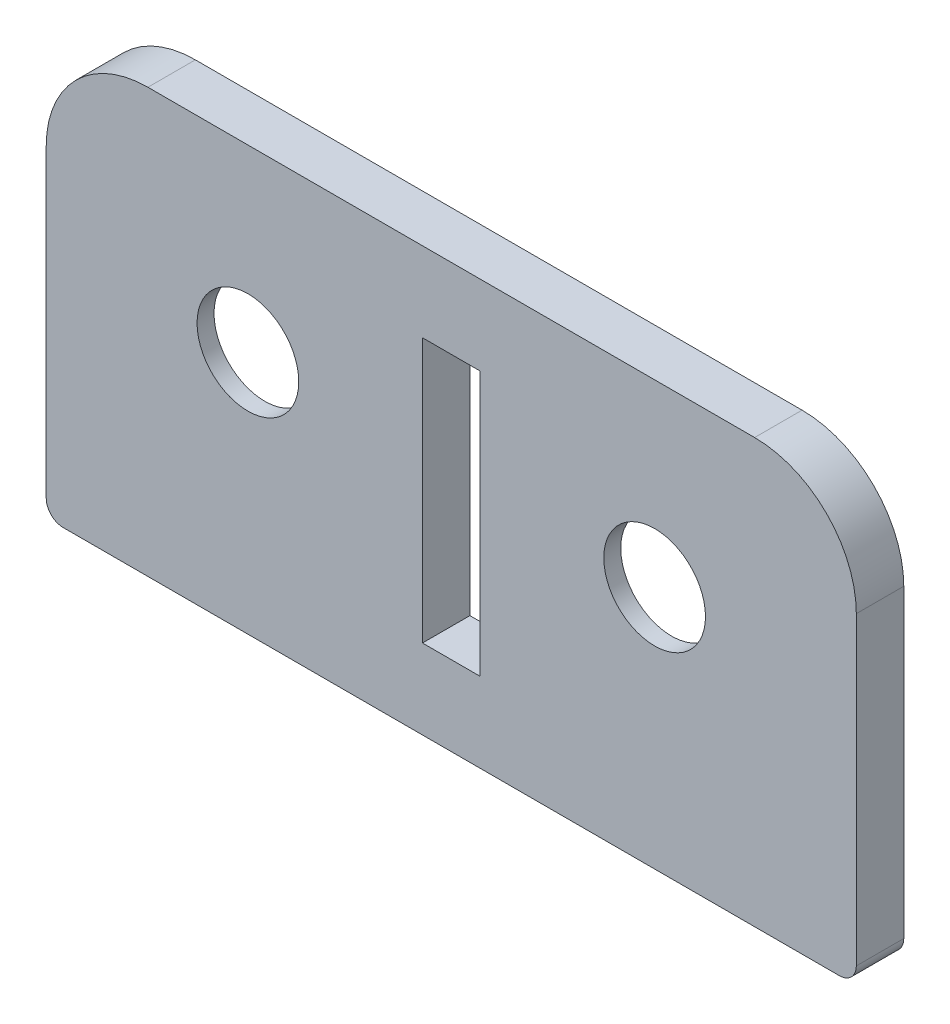
ISO-10303-21;
HEADER;
FILE_DESCRIPTION(('STEP AP214'),'2;1');
FILE_NAME('part.step','',(''),(''),'','','');
FILE_SCHEMA(('AUTOMOTIVE_DESIGN { 1 0 10303 214 1 1 1 1 }'));
ENDSEC;
DATA;
#1=APPLICATION_CONTEXT('core data for automotive mechanical design processes');
#2=APPLICATION_PROTOCOL_DEFINITION('international standard','automotive_design',2000,#1);
#3=PRODUCT_CONTEXT('',#1,'mechanical');
#4=PRODUCT('Part','Part','',(#3));
#5=PRODUCT_RELATED_PRODUCT_CATEGORY('part','',(#4));
#6=PRODUCT_DEFINITION_FORMATION('','',#4);
#7=PRODUCT_DEFINITION_CONTEXT('part definition',#1,'design');
#8=PRODUCT_DEFINITION('design','',#6,#7);
#9=PRODUCT_DEFINITION_SHAPE('','',#8);
#10=(LENGTH_UNIT() NAMED_UNIT(*) SI_UNIT(.MILLI.,.METRE.));
#11=(NAMED_UNIT(*) PLANE_ANGLE_UNIT() SI_UNIT($,.RADIAN.));
#12=(NAMED_UNIT(*) SI_UNIT($,.STERADIAN.) SOLID_ANGLE_UNIT());
#13=UNCERTAINTY_MEASURE_WITH_UNIT(LENGTH_MEASURE(1.E-05),#10,'distance_accuracy_value','');
#14=(GEOMETRIC_REPRESENTATION_CONTEXT(3) GLOBAL_UNCERTAINTY_ASSIGNED_CONTEXT((#13)) GLOBAL_UNIT_ASSIGNED_CONTEXT((#10,
#11,#12)) REPRESENTATION_CONTEXT('',''));
#15=CARTESIAN_POINT('',(0.,0.,0.));
#16=DIRECTION('',(0.,0.,1.));
#17=DIRECTION('',(1.,0.,0.));
#18=AXIS2_PLACEMENT_3D('',#15,#16,#17);
#19=CARTESIAN_POINT('',(-6.,0.949999999999997,1.4));
#20=DIRECTION('',(0.,0.,-1.));
#21=DIRECTION('',(-1.,0.,0.));
#22=AXIS2_PLACEMENT_3D('',#19,#20,#21);
#23=CYLINDRICAL_SURFACE('',#22,1.5);
#24=CARTESIAN_POINT('',(-6.,0.949999999999997,1.4));
#25=DIRECTION('',(0.,0.,1.));
#26=DIRECTION('',(1.,0.,0.));
#27=AXIS2_PLACEMENT_3D('',#24,#25,#26);
#28=CIRCLE('',#27,1.5);
#29=CARTESIAN_POINT('',(-4.5,0.949999999999997,1.4));
#30=VERTEX_POINT('',#29);
#31=EDGE_CURVE('E192',#30,#30,#28,.T.);
#32=ORIENTED_EDGE('',*,*,#31,.T.);
#33=EDGE_LOOP('',(#32));
#34=FACE_BOUND('',#33,.T.);
#35=CARTESIAN_POINT('',(-6.,0.949999999999997,0.9));
#36=DIRECTION('',(0.,0.,-1.));
#37=DIRECTION('',(-1.,0.,0.));
#38=AXIS2_PLACEMENT_3D('',#35,#36,#37);
#39=CIRCLE('',#38,1.5);
#40=CARTESIAN_POINT('',(-7.5,0.949999999999997,0.9));
#41=VERTEX_POINT('',#40);
#42=EDGE_CURVE('E36',#41,#41,#39,.T.);
#43=ORIENTED_EDGE('',*,*,#42,.T.);
#44=EDGE_LOOP('',(#43));
#45=FACE_BOUND('',#44,.T.);
#46=ADVANCED_FACE('F33',(#34,#45),#23,.F.);
#47=CARTESIAN_POINT('',(6.,0.949999999999998,1.4));
#48=DIRECTION('',(0.,0.,-1.));
#49=DIRECTION('',(-1.,0.,0.));
#50=AXIS2_PLACEMENT_3D('',#47,#48,#49);
#51=CYLINDRICAL_SURFACE('',#50,1.5);
#52=CARTESIAN_POINT('',(6.,0.949999999999998,1.4));
#53=DIRECTION('',(0.,0.,1.));
#54=DIRECTION('',(1.,0.,0.));
#55=AXIS2_PLACEMENT_3D('',#52,#53,#54);
#56=CIRCLE('',#55,1.5);
#57=CARTESIAN_POINT('',(7.5,0.949999999999998,1.4));
#58=VERTEX_POINT('',#57);
#59=EDGE_CURVE('E157',#58,#58,#56,.T.);
#60=ORIENTED_EDGE('',*,*,#59,.T.);
#61=EDGE_LOOP('',(#60));
#62=FACE_BOUND('',#61,.T.);
#63=CARTESIAN_POINT('',(6.,0.949999999999998,0.9));
#64=DIRECTION('',(0.,0.,-1.));
#65=DIRECTION('',(-1.,0.,0.));
#66=AXIS2_PLACEMENT_3D('',#63,#64,#65);
#67=CIRCLE('',#66,1.5);
#68=CARTESIAN_POINT('',(4.5,0.949999999999998,0.9));
#69=VERTEX_POINT('',#68);
#70=EDGE_CURVE('E165',#69,#69,#67,.T.);
#71=ORIENTED_EDGE('',*,*,#70,.T.);
#72=EDGE_LOOP('',(#71));
#73=FACE_BOUND('',#72,.T.);
#74=ADVANCED_FACE('F274',(#62,#73),#51,.F.);
#75=CARTESIAN_POINT('',(0.850000000000004,0.,1.4));
#76=DIRECTION('',(-1.,0.,0.));
#77=DIRECTION('',(0.,0.,1.));
#78=AXIS2_PLACEMENT_3D('',#75,#76,#77);
#79=PLANE('',#78);
#80=DIRECTION('',(0.,1.,0.));
#81=VECTOR('',#80,1.);
#82=CARTESIAN_POINT('',(0.850000000000004,0.,0.));
#83=LINE('',#82,#81);
#84=CARTESIAN_POINT('',(0.850000000000004,-3.9,0.));
#85=VERTEX_POINT('',#84);
#86=CARTESIAN_POINT('',(0.850000000000004,3.9,0.));
#87=VERTEX_POINT('',#86);
#88=EDGE_CURVE('E186',#85,#87,#83,.T.);
#89=ORIENTED_EDGE('',*,*,#88,.F.);
#90=DIRECTION('',(0.,0.,-1.));
#91=VECTOR('',#90,1.);
#92=CARTESIAN_POINT('',(0.850000000000004,-3.9,1.4));
#93=LINE('',#92,#91);
#94=CARTESIAN_POINT('',(0.850000000000004,-3.9,1.4));
#95=VERTEX_POINT('',#94);
#96=EDGE_CURVE('E11',#95,#85,#93,.T.);
#97=ORIENTED_EDGE('',*,*,#96,.F.);
#98=DIRECTION('',(0.,1.,0.));
#99=VECTOR('',#98,1.);
#100=CARTESIAN_POINT('',(0.850000000000004,0.,1.4));
#101=LINE('',#100,#99);
#102=CARTESIAN_POINT('',(0.850000000000004,3.9,1.4));
#103=VERTEX_POINT('',#102);
#104=EDGE_CURVE('E150',#95,#103,#101,.T.);
#105=ORIENTED_EDGE('',*,*,#104,.T.);
#106=DIRECTION('',(0.,0.,-1.));
#107=VECTOR('',#106,1.);
#108=CARTESIAN_POINT('',(0.850000000000004,3.9,1.4));
#109=LINE('',#108,#107);
#110=EDGE_CURVE('E98',#103,#87,#109,.T.);
#111=ORIENTED_EDGE('',*,*,#110,.T.);
#112=EDGE_LOOP('',(#89,#97,#105,#111));
#113=FACE_BOUND('',#112,.T.);
#114=ADVANCED_FACE('F279',(#113),#79,.T.);
#115=CARTESIAN_POINT('',(0.,-3.9,1.4));
#116=DIRECTION('',(0.,1.,0.));
#117=DIRECTION('',(0.,0.,1.));
#118=AXIS2_PLACEMENT_3D('',#115,#116,#117);
#119=PLANE('',#118);
#120=DIRECTION('',(1.,0.,0.));
#121=VECTOR('',#120,1.);
#122=CARTESIAN_POINT('',(0.,-3.9,0.));
#123=LINE('',#122,#121);
#124=CARTESIAN_POINT('',(-0.849999999999996,-3.9,0.));
#125=VERTEX_POINT('',#124);
#126=EDGE_CURVE('E139',#125,#85,#123,.T.);
#127=ORIENTED_EDGE('',*,*,#126,.F.);
#128=DIRECTION('',(0.,0.,-1.));
#129=VECTOR('',#128,1.);
#130=CARTESIAN_POINT('',(-0.849999999999996,-3.9,1.4));
#131=LINE('',#130,#129);
#132=CARTESIAN_POINT('',(-0.849999999999996,-3.9,1.4));
#133=VERTEX_POINT('',#132);
#134=EDGE_CURVE('E42',#133,#125,#131,.T.);
#135=ORIENTED_EDGE('',*,*,#134,.F.);
#136=DIRECTION('',(1.,0.,0.));
#137=VECTOR('',#136,1.);
#138=CARTESIAN_POINT('',(0.,-3.9,1.4));
#139=LINE('',#138,#137);
#140=EDGE_CURVE('E137',#133,#95,#139,.T.);
#141=ORIENTED_EDGE('',*,*,#140,.T.);
#142=ORIENTED_EDGE('',*,*,#96,.T.);
#143=EDGE_LOOP('',(#127,#135,#141,#142));
#144=FACE_BOUND('',#143,.T.);
#145=ADVANCED_FACE('F135',(#144),#119,.T.);
#146=CARTESIAN_POINT('',(-0.849999999999996,0.,1.4));
#147=DIRECTION('',(-1.,0.,0.));
#148=DIRECTION('',(0.,0.,1.));
#149=AXIS2_PLACEMENT_3D('',#146,#147,#148);
#150=PLANE('',#149);
#151=DIRECTION('',(0.,1.,0.));
#152=VECTOR('',#151,1.);
#153=CARTESIAN_POINT('',(-0.849999999999996,0.,0.));
#154=LINE('',#153,#152);
#155=CARTESIAN_POINT('',(-0.849999999999996,3.9,0.));
#156=VERTEX_POINT('',#155);
#157=EDGE_CURVE('E189',#125,#156,#154,.T.);
#158=ORIENTED_EDGE('',*,*,#157,.T.);
#159=DIRECTION('',(0.,0.,-1.));
#160=VECTOR('',#159,1.);
#161=CARTESIAN_POINT('',(-0.849999999999996,3.9,1.4));
#162=LINE('',#161,#160);
#163=CARTESIAN_POINT('',(-0.849999999999996,3.9,1.4));
#164=VERTEX_POINT('',#163);
#165=EDGE_CURVE('E142',#164,#156,#162,.T.);
#166=ORIENTED_EDGE('',*,*,#165,.F.);
#167=DIRECTION('',(0.,1.,0.));
#168=VECTOR('',#167,1.);
#169=CARTESIAN_POINT('',(-0.849999999999996,0.,1.4));
#170=LINE('',#169,#168);
#171=EDGE_CURVE('E145',#133,#164,#170,.T.);
#172=ORIENTED_EDGE('',*,*,#171,.F.);
#173=ORIENTED_EDGE('',*,*,#134,.T.);
#174=EDGE_LOOP('',(#158,#166,#172,#173));
#175=FACE_BOUND('',#174,.T.);
#176=ADVANCED_FACE('F146',(#175),#150,.F.);
#177=CARTESIAN_POINT('',(-11.45,-5.75,1.4));
#178=DIRECTION('',(0.,0.,-1.));
#179=DIRECTION('',(-1.,0.,0.));
#180=AXIS2_PLACEMENT_3D('',#177,#178,#179);
#181=CYLINDRICAL_SURFACE('',#180,0.5);
#182=CARTESIAN_POINT('',(-11.45,-5.75,0.));
#183=DIRECTION('',(0.,0.,1.));
#184=DIRECTION('',(1.,0.,0.));
#185=AXIS2_PLACEMENT_3D('',#182,#183,#184);
#186=CIRCLE('',#185,0.5);
#187=CARTESIAN_POINT('',(-11.45,-6.25,0.));
#188=VERTEX_POINT('',#187);
#189=CARTESIAN_POINT('',(-11.95,-5.75,0.));
#190=VERTEX_POINT('',#189);
#191=EDGE_CURVE('E161',#188,#190,#186,.F.);
#192=ORIENTED_EDGE('',*,*,#191,.F.);
#193=DIRECTION('',(0.,0.,-1.));
#194=VECTOR('',#193,1.);
#195=CARTESIAN_POINT('',(-11.45,-6.25,1.4));
#196=LINE('',#195,#194);
#197=CARTESIAN_POINT('',(-11.45,-6.25,1.4));
#198=VERTEX_POINT('',#197);
#199=EDGE_CURVE('E105',#198,#188,#196,.T.);
#200=ORIENTED_EDGE('',*,*,#199,.F.);
#201=CARTESIAN_POINT('',(-11.45,-5.75,1.4));
#202=DIRECTION('',(0.,0.,1.));
#203=DIRECTION('',(1.,0.,0.));
#204=AXIS2_PLACEMENT_3D('',#201,#202,#203);
#205=CIRCLE('',#204,0.5);
#206=CARTESIAN_POINT('',(-11.95,-5.75,1.4));
#207=VERTEX_POINT('',#206);
#208=EDGE_CURVE('E229',#198,#207,#205,.F.);
#209=ORIENTED_EDGE('',*,*,#208,.T.);
#210=DIRECTION('',(0.,0.,-1.));
#211=VECTOR('',#210,1.);
#212=CARTESIAN_POINT('',(-11.95,-5.75,1.4));
#213=LINE('',#212,#211);
#214=EDGE_CURVE('E160',#207,#190,#213,.T.);
#215=ORIENTED_EDGE('',*,*,#214,.T.);
#216=EDGE_LOOP('',(#192,#200,#209,#215));
#217=FACE_BOUND('',#216,.T.);
#218=ADVANCED_FACE('F262',(#217),#181,.T.);
#219=CARTESIAN_POINT('',(0.,-6.25,1.4));
#220=DIRECTION('',(0.,-1.,0.));
#221=DIRECTION('',(1.,0.,0.));
#222=AXIS2_PLACEMENT_3D('',#219,#220,#221);
#223=PLANE('',#222);
#224=DIRECTION('',(-1.,0.,0.));
#225=VECTOR('',#224,1.);
#226=CARTESIAN_POINT('',(0.,-6.25,0.));
#227=LINE('',#226,#225);
#228=CARTESIAN_POINT('',(11.45,-6.25,0.));
#229=VERTEX_POINT('',#228);
#230=EDGE_CURVE('E164',#229,#188,#227,.T.);
#231=ORIENTED_EDGE('',*,*,#230,.F.);
#232=DIRECTION('',(0.,0.,-1.));
#233=VECTOR('',#232,1.);
#234=CARTESIAN_POINT('',(11.45,-6.25,1.4));
#235=LINE('',#234,#233);
#236=CARTESIAN_POINT('',(11.45,-6.25,1.4));
#237=VERTEX_POINT('',#236);
#238=EDGE_CURVE('E210',#237,#229,#235,.T.);
#239=ORIENTED_EDGE('',*,*,#238,.F.);
#240=DIRECTION('',(-1.,0.,0.));
#241=VECTOR('',#240,1.);
#242=CARTESIAN_POINT('',(0.,-6.25,1.4));
#243=LINE('',#242,#241);
#244=EDGE_CURVE('E231',#237,#198,#243,.T.);
#245=ORIENTED_EDGE('',*,*,#244,.T.);
#246=ORIENTED_EDGE('',*,*,#199,.T.);
#247=EDGE_LOOP('',(#231,#239,#245,#246));
#248=FACE_BOUND('',#247,.T.);
#249=ADVANCED_FACE('F264',(#248),#223,.T.);
#250=CARTESIAN_POINT('',(11.45,-5.75,1.4));
#251=DIRECTION('',(0.,0.,-1.));
#252=DIRECTION('',(-1.,0.,0.));
#253=AXIS2_PLACEMENT_3D('',#250,#251,#252);
#254=CYLINDRICAL_SURFACE('',#253,0.5);
#255=CARTESIAN_POINT('',(11.45,-5.75,0.));
#256=DIRECTION('',(0.,0.,1.));
#257=DIRECTION('',(1.,0.,0.));
#258=AXIS2_PLACEMENT_3D('',#255,#256,#257);
#259=CIRCLE('',#258,0.5);
#260=CARTESIAN_POINT('',(11.95,-5.75,0.));
#261=VERTEX_POINT('',#260);
#262=EDGE_CURVE('E168',#229,#261,#259,.T.);
#263=ORIENTED_EDGE('',*,*,#262,.T.);
#264=DIRECTION('',(0.,0.,-1.));
#265=VECTOR('',#264,1.);
#266=CARTESIAN_POINT('',(11.95,-5.75,1.4));
#267=LINE('',#266,#265);
#268=CARTESIAN_POINT('',(11.95,-5.75,1.4));
#269=VERTEX_POINT('',#268);
#270=EDGE_CURVE('E207',#269,#261,#267,.T.);
#271=ORIENTED_EDGE('',*,*,#270,.F.);
#272=CARTESIAN_POINT('',(11.45,-5.75,1.4));
#273=DIRECTION('',(0.,0.,1.));
#274=DIRECTION('',(1.,0.,0.));
#275=AXIS2_PLACEMENT_3D('',#272,#273,#274);
#276=CIRCLE('',#275,0.5);
#277=EDGE_CURVE('E234',#237,#269,#276,.T.);
#278=ORIENTED_EDGE('',*,*,#277,.F.);
#279=ORIENTED_EDGE('',*,*,#238,.T.);
#280=EDGE_LOOP('',(#263,#271,#278,#279));
#281=FACE_BOUND('',#280,.T.);
#282=ADVANCED_FACE('F269',(#281),#254,.T.);
#283=CARTESIAN_POINT('',(11.95,0.,1.4));
#284=DIRECTION('',(-1.,0.,0.));
#285=DIRECTION('',(0.,0.,1.));
#286=AXIS2_PLACEMENT_3D('',#283,#284,#285);
#287=PLANE('',#286);
#288=DIRECTION('',(0.,1.,0.));
#289=VECTOR('',#288,1.);
#290=CARTESIAN_POINT('',(11.95,0.,0.));
#291=LINE('',#290,#289);
#292=CARTESIAN_POINT('',(11.95,3.24999999999998,0.));
#293=VERTEX_POINT('',#292);
#294=EDGE_CURVE('E171',#261,#293,#291,.T.);
#295=ORIENTED_EDGE('',*,*,#294,.T.);
#296=DIRECTION('',(0.,0.,-1.));
#297=VECTOR('',#296,1.);
#298=CARTESIAN_POINT('',(11.95,3.24999999999998,1.4));
#299=LINE('',#298,#297);
#300=CARTESIAN_POINT('',(11.95,3.24999999999998,1.4));
#301=VERTEX_POINT('',#300);
#302=EDGE_CURVE('E204',#301,#293,#299,.T.);
#303=ORIENTED_EDGE('',*,*,#302,.F.);
#304=DIRECTION('',(0.,1.,0.));
#305=VECTOR('',#304,1.);
#306=CARTESIAN_POINT('',(11.95,0.,1.4));
#307=LINE('',#306,#305);
#308=EDGE_CURVE('E237',#269,#301,#307,.T.);
#309=ORIENTED_EDGE('',*,*,#308,.F.);
#310=ORIENTED_EDGE('',*,*,#270,.T.);
#311=EDGE_LOOP('',(#295,#303,#309,#310));
#312=FACE_BOUND('',#311,.T.);
#313=ADVANCED_FACE('F335',(#312),#287,.F.);
#314=CARTESIAN_POINT('',(8.95,3.25,1.4));
#315=DIRECTION('',(0.,0.,-1.));
#316=DIRECTION('',(-1.,0.,0.));
#317=AXIS2_PLACEMENT_3D('',#314,#315,#316);
#318=CYLINDRICAL_SURFACE('',#317,3.);
#319=CARTESIAN_POINT('',(8.95,3.25,0.));
#320=DIRECTION('',(0.,0.,1.));
#321=DIRECTION('',(1.,0.,0.));
#322=AXIS2_PLACEMENT_3D('',#319,#320,#321);
#323=CIRCLE('',#322,3.);
#324=CARTESIAN_POINT('',(8.94999999999998,6.25,0.));
#325=VERTEX_POINT('',#324);
#326=EDGE_CURVE('E174',#293,#325,#323,.T.);
#327=ORIENTED_EDGE('',*,*,#326,.T.);
#328=DIRECTION('',(0.,0.,-1.));
#329=VECTOR('',#328,1.);
#330=CARTESIAN_POINT('',(8.94999999999998,6.25,1.4));
#331=LINE('',#330,#329);
#332=CARTESIAN_POINT('',(8.94999999999998,6.25,1.4));
#333=VERTEX_POINT('',#332);
#334=EDGE_CURVE('E201',#333,#325,#331,.T.);
#335=ORIENTED_EDGE('',*,*,#334,.F.);
#336=CARTESIAN_POINT('',(8.95,3.25,1.4));
#337=DIRECTION('',(0.,0.,1.));
#338=DIRECTION('',(1.,0.,0.));
#339=AXIS2_PLACEMENT_3D('',#336,#337,#338);
#340=CIRCLE('',#339,3.);
#341=EDGE_CURVE('E240',#301,#333,#340,.T.);
#342=ORIENTED_EDGE('',*,*,#341,.F.);
#343=ORIENTED_EDGE('',*,*,#302,.T.);
#344=EDGE_LOOP('',(#327,#335,#342,#343));
#345=FACE_BOUND('',#344,.T.);
#346=ADVANCED_FACE('F331',(#345),#318,.T.);
#347=CARTESIAN_POINT('',(0.,6.25,1.4));
#348=DIRECTION('',(0.,-1.,0.));
#349=DIRECTION('',(1.,0.,0.));
#350=AXIS2_PLACEMENT_3D('',#347,#348,#349);
#351=PLANE('',#350);
#352=DIRECTION('',(-1.,0.,0.));
#353=VECTOR('',#352,1.);
#354=CARTESIAN_POINT('',(0.,6.25,0.));
#355=LINE('',#354,#353);
#356=CARTESIAN_POINT('',(-8.94999999999997,6.25,0.));
#357=VERTEX_POINT('',#356);
#358=EDGE_CURVE('E177',#325,#357,#355,.T.);
#359=ORIENTED_EDGE('',*,*,#358,.T.);
#360=DIRECTION('',(0.,0.,-1.));
#361=VECTOR('',#360,1.);
#362=CARTESIAN_POINT('',(-8.94999999999997,6.25,1.4));
#363=LINE('',#362,#361);
#364=CARTESIAN_POINT('',(-8.94999999999997,6.25,1.4));
#365=VERTEX_POINT('',#364);
#366=EDGE_CURVE('E198',#365,#357,#363,.T.);
#367=ORIENTED_EDGE('',*,*,#366,.F.);
#368=DIRECTION('',(-1.,0.,0.));
#369=VECTOR('',#368,1.);
#370=CARTESIAN_POINT('',(0.,6.25,1.4));
#371=LINE('',#370,#369);
#372=EDGE_CURVE('E243',#333,#365,#371,.T.);
#373=ORIENTED_EDGE('',*,*,#372,.F.);
#374=ORIENTED_EDGE('',*,*,#334,.T.);
#375=EDGE_LOOP('',(#359,#367,#373,#374));
#376=FACE_BOUND('',#375,.T.);
#377=ADVANCED_FACE('F328',(#376),#351,.F.);
#378=CARTESIAN_POINT('',(-8.94999999999999,3.25,1.4));
#379=DIRECTION('',(0.,0.,-1.));
#380=DIRECTION('',(-1.,0.,0.));
#381=AXIS2_PLACEMENT_3D('',#378,#379,#380);
#382=CYLINDRICAL_SURFACE('',#381,3.);
#383=CARTESIAN_POINT('',(-8.94999999999999,3.25,0.));
#384=DIRECTION('',(0.,0.,1.));
#385=DIRECTION('',(1.,0.,0.));
#386=AXIS2_PLACEMENT_3D('',#383,#384,#385);
#387=CIRCLE('',#386,3.);
#388=CARTESIAN_POINT('',(-11.95,3.24999999999998,0.));
#389=VERTEX_POINT('',#388);
#390=EDGE_CURVE('E180',#357,#389,#387,.T.);
#391=ORIENTED_EDGE('',*,*,#390,.T.);
#392=DIRECTION('',(0.,0.,-1.));
#393=VECTOR('',#392,1.);
#394=CARTESIAN_POINT('',(-11.95,3.24999999999998,1.4));
#395=LINE('',#394,#393);
#396=CARTESIAN_POINT('',(-11.95,3.24999999999998,1.4));
#397=VERTEX_POINT('',#396);
#398=EDGE_CURVE('E196',#397,#389,#395,.T.);
#399=ORIENTED_EDGE('',*,*,#398,.F.);
#400=CARTESIAN_POINT('',(-8.94999999999999,3.25,1.4));
#401=DIRECTION('',(0.,0.,1.));
#402=DIRECTION('',(1.,0.,0.));
#403=AXIS2_PLACEMENT_3D('',#400,#401,#402);
#404=CIRCLE('',#403,3.);
#405=EDGE_CURVE('E246',#365,#397,#404,.T.);
#406=ORIENTED_EDGE('',*,*,#405,.F.);
#407=ORIENTED_EDGE('',*,*,#366,.T.);
#408=EDGE_LOOP('',(#391,#399,#406,#407));
#409=FACE_BOUND('',#408,.T.);
#410=ADVANCED_FACE('F257',(#409),#382,.T.);
#411=CARTESIAN_POINT('',(0.,3.9,1.4));
#412=DIRECTION('',(0.,1.,0.));
#413=DIRECTION('',(0.,0.,1.));
#414=AXIS2_PLACEMENT_3D('',#411,#412,#413);
#415=PLANE('',#414);
#416=DIRECTION('',(1.,0.,0.));
#417=VECTOR('',#416,1.);
#418=CARTESIAN_POINT('',(0.,3.9,0.));
#419=LINE('',#418,#417);
#420=EDGE_CURVE('E91',#156,#87,#419,.T.);
#421=ORIENTED_EDGE('',*,*,#420,.T.);
#422=ORIENTED_EDGE('',*,*,#110,.F.);
#423=DIRECTION('',(1.,0.,0.));
#424=VECTOR('',#423,1.);
#425=CARTESIAN_POINT('',(0.,3.9,1.4));
#426=LINE('',#425,#424);
#427=EDGE_CURVE('E51',#164,#103,#426,.T.);
#428=ORIENTED_EDGE('',*,*,#427,.F.);
#429=ORIENTED_EDGE('',*,*,#165,.T.);
#430=EDGE_LOOP('',(#421,#422,#428,#429));
#431=FACE_BOUND('',#430,.T.);
#432=ADVANCED_FACE('F316',(#431),#415,.F.);
#433=CARTESIAN_POINT('',(-11.95,0.,1.4));
#434=DIRECTION('',(-1.,0.,0.));
#435=DIRECTION('',(0.,0.,1.));
#436=AXIS2_PLACEMENT_3D('',#433,#434,#435);
#437=PLANE('',#436);
#438=DIRECTION('',(0.,1.,0.));
#439=VECTOR('',#438,1.);
#440=CARTESIAN_POINT('',(-11.95,0.,0.));
#441=LINE('',#440,#439);
#442=EDGE_CURVE('E183',#190,#389,#441,.T.);
#443=ORIENTED_EDGE('',*,*,#442,.F.);
#444=ORIENTED_EDGE('',*,*,#214,.F.);
#445=DIRECTION('',(0.,1.,0.));
#446=VECTOR('',#445,1.);
#447=CARTESIAN_POINT('',(-11.95,0.,1.4));
#448=LINE('',#447,#446);
#449=EDGE_CURVE('E152',#207,#397,#448,.T.);
#450=ORIENTED_EDGE('',*,*,#449,.T.);
#451=ORIENTED_EDGE('',*,*,#398,.T.);
#452=EDGE_LOOP('',(#443,#444,#450,#451));
#453=FACE_BOUND('',#452,.T.);
#454=ADVANCED_FACE('F251',(#453),#437,.T.);
#455=CARTESIAN_POINT('',(0.,0.,1.4));
#456=DIRECTION('',(0.,0.,1.));
#457=DIRECTION('',(1.,0.,0.));
#458=AXIS2_PLACEMENT_3D('',#455,#456,#457);
#459=PLANE('',#458);
#460=ORIENTED_EDGE('',*,*,#31,.F.);
#461=EDGE_LOOP('',(#460));
#462=FACE_BOUND('',#461,.T.);
#463=ORIENTED_EDGE('',*,*,#208,.F.);
#464=ORIENTED_EDGE('',*,*,#244,.F.);
#465=ORIENTED_EDGE('',*,*,#277,.T.);
#466=ORIENTED_EDGE('',*,*,#308,.T.);
#467=ORIENTED_EDGE('',*,*,#341,.T.);
#468=ORIENTED_EDGE('',*,*,#372,.T.);
#469=ORIENTED_EDGE('',*,*,#405,.T.);
#470=ORIENTED_EDGE('',*,*,#449,.F.);
#471=EDGE_LOOP('',(#463,#464,#465,#466,#467,#468,#469,#470));
#472=FACE_BOUND('',#471,.T.);
#473=ORIENTED_EDGE('',*,*,#104,.F.);
#474=ORIENTED_EDGE('',*,*,#140,.F.);
#475=ORIENTED_EDGE('',*,*,#171,.T.);
#476=ORIENTED_EDGE('',*,*,#427,.T.);
#477=EDGE_LOOP('',(#473,#474,#475,#476));
#478=FACE_BOUND('',#477,.T.);
#479=ORIENTED_EDGE('',*,*,#59,.F.);
#480=EDGE_LOOP('',(#479));
#481=FACE_BOUND('',#480,.T.);
#482=ADVANCED_FACE('F148',(#462,#472,#478,#481),#459,.T.);
#483=CARTESIAN_POINT('',(0.,0.,0.));
#484=DIRECTION('',(0.,0.,1.));
#485=DIRECTION('',(1.,0.,0.));
#486=AXIS2_PLACEMENT_3D('',#483,#484,#485);
#487=PLANE('',#486);
#488=CARTESIAN_POINT('',(-6.,0.949999999999997,0.));
#489=DIRECTION('',(0.,0.,-1.));
#490=DIRECTION('',(-1.,0.,0.));
#491=AXIS2_PLACEMENT_3D('',#488,#489,#490);
#492=CIRCLE('',#491,3.98621329931774);
#493=CARTESIAN_POINT('',(-9.98621329931774,0.949999999999997,0.));
#494=VERTEX_POINT('',#493);
#495=EDGE_CURVE('E224',#494,#494,#492,.T.);
#496=ORIENTED_EDGE('',*,*,#495,.F.);
#497=EDGE_LOOP('',(#496));
#498=FACE_BOUND('',#497,.T.);
#499=CARTESIAN_POINT('',(6.,0.949999999999998,0.));
#500=DIRECTION('',(0.,0.,-1.));
#501=DIRECTION('',(-1.,0.,0.));
#502=AXIS2_PLACEMENT_3D('',#499,#500,#501);
#503=CIRCLE('',#502,3.98621329931774);
#504=CARTESIAN_POINT('',(2.01378670068226,0.949999999999998,0.));
#505=VERTEX_POINT('',#504);
#506=EDGE_CURVE('E217',#505,#505,#503,.T.);
#507=ORIENTED_EDGE('',*,*,#506,.F.);
#508=EDGE_LOOP('',(#507));
#509=FACE_BOUND('',#508,.T.);
#510=ORIENTED_EDGE('',*,*,#191,.T.);
#511=ORIENTED_EDGE('',*,*,#442,.T.);
#512=ORIENTED_EDGE('',*,*,#390,.F.);
#513=ORIENTED_EDGE('',*,*,#358,.F.);
#514=ORIENTED_EDGE('',*,*,#326,.F.);
#515=ORIENTED_EDGE('',*,*,#294,.F.);
#516=ORIENTED_EDGE('',*,*,#262,.F.);
#517=ORIENTED_EDGE('',*,*,#230,.T.);
#518=EDGE_LOOP('',(#510,#511,#512,#513,#514,#515,#516,#517));
#519=FACE_BOUND('',#518,.T.);
#520=ORIENTED_EDGE('',*,*,#88,.T.);
#521=ORIENTED_EDGE('',*,*,#420,.F.);
#522=ORIENTED_EDGE('',*,*,#157,.F.);
#523=ORIENTED_EDGE('',*,*,#126,.T.);
#524=EDGE_LOOP('',(#520,#521,#522,#523));
#525=FACE_BOUND('',#524,.T.);
#526=ADVANCED_FACE('F259',(#498,#509,#519,#525),#487,.F.);
#527=CARTESIAN_POINT('',(6.,0.949999999999998,0.9));
#528=DIRECTION('',(0.,0.,-1.));
#529=DIRECTION('',(-1.,0.,0.));
#530=AXIS2_PLACEMENT_3D('',#527,#528,#529);
#531=CYLINDRICAL_SURFACE('',#530,3.98621329931774);
#532=CARTESIAN_POINT('',(6.,0.949999999999998,0.9));
#533=DIRECTION('',(0.,0.,-1.));
#534=DIRECTION('',(-1.,0.,0.));
#535=AXIS2_PLACEMENT_3D('',#532,#533,#534);
#536=CIRCLE('',#535,3.98621329931774);
#537=CARTESIAN_POINT('',(2.01378670068226,0.949999999999998,0.9));
#538=VERTEX_POINT('',#537);
#539=EDGE_CURVE('E213',#538,#538,#536,.T.);
#540=ORIENTED_EDGE('',*,*,#539,.F.);
#541=EDGE_LOOP('',(#540));
#542=FACE_BOUND('',#541,.T.);
#543=ORIENTED_EDGE('',*,*,#506,.T.);
#544=EDGE_LOOP('',(#543));
#545=FACE_BOUND('',#544,.T.);
#546=ADVANCED_FACE('F298',(#542,#545),#531,.F.);
#547=CARTESIAN_POINT('',(6.,0.949999999999998,0.9));
#548=DIRECTION('',(0.,0.,-1.));
#549=DIRECTION('',(-1.,0.,0.));
#550=AXIS2_PLACEMENT_3D('',#547,#548,#549);
#551=PLANE('',#550);
#552=ORIENTED_EDGE('',*,*,#70,.F.);
#553=EDGE_LOOP('',(#552));
#554=FACE_BOUND('',#553,.T.);
#555=ORIENTED_EDGE('',*,*,#539,.T.);
#556=EDGE_LOOP('',(#555));
#557=FACE_BOUND('',#556,.T.);
#558=ADVANCED_FACE('F303',(#554,#557),#551,.T.);
#559=CARTESIAN_POINT('',(-6.,0.949999999999997,0.9));
#560=DIRECTION('',(0.,0.,-1.));
#561=DIRECTION('',(-1.,0.,0.));
#562=AXIS2_PLACEMENT_3D('',#559,#560,#561);
#563=CYLINDRICAL_SURFACE('',#562,3.98621329931774);
#564=CARTESIAN_POINT('',(-6.,0.949999999999997,0.9));
#565=DIRECTION('',(0.,0.,-1.));
#566=DIRECTION('',(-1.,0.,0.));
#567=AXIS2_PLACEMENT_3D('',#564,#565,#566);
#568=CIRCLE('',#567,3.98621329931774);
#569=CARTESIAN_POINT('',(-9.98621329931774,0.949999999999997,0.9));
#570=VERTEX_POINT('',#569);
#571=EDGE_CURVE('E287',#570,#570,#568,.T.);
#572=ORIENTED_EDGE('',*,*,#571,.F.);
#573=EDGE_LOOP('',(#572));
#574=FACE_BOUND('',#573,.T.);
#575=ORIENTED_EDGE('',*,*,#495,.T.);
#576=EDGE_LOOP('',(#575));
#577=FACE_BOUND('',#576,.T.);
#578=ADVANCED_FACE('F294',(#574,#577),#563,.F.);
#579=CARTESIAN_POINT('',(-6.,0.949999999999997,0.9));
#580=DIRECTION('',(0.,0.,-1.));
#581=DIRECTION('',(-1.,0.,0.));
#582=AXIS2_PLACEMENT_3D('',#579,#580,#581);
#583=PLANE('',#582);
#584=ORIENTED_EDGE('',*,*,#42,.F.);
#585=EDGE_LOOP('',(#584));
#586=FACE_BOUND('',#585,.T.);
#587=ORIENTED_EDGE('',*,*,#571,.T.);
#588=EDGE_LOOP('',(#587));
#589=FACE_BOUND('',#588,.T.);
#590=ADVANCED_FACE('F406',(#586,#589),#583,.T.);
#591=CLOSED_SHELL('',(#46,#74,#114,#145,#176,#218,#249,#282,#313,#346,#377,#410,#432,#454,#482,
#526,#546,#558,#578,#590));
#592=MANIFOLD_SOLID_BREP('B2',#591);
#593=ADVANCED_BREP_SHAPE_REPRESENTATION('',(#18,#592),#14);
#594=SHAPE_DEFINITION_REPRESENTATION(#9,#593);
ENDSEC;
END-ISO-10303-21;
